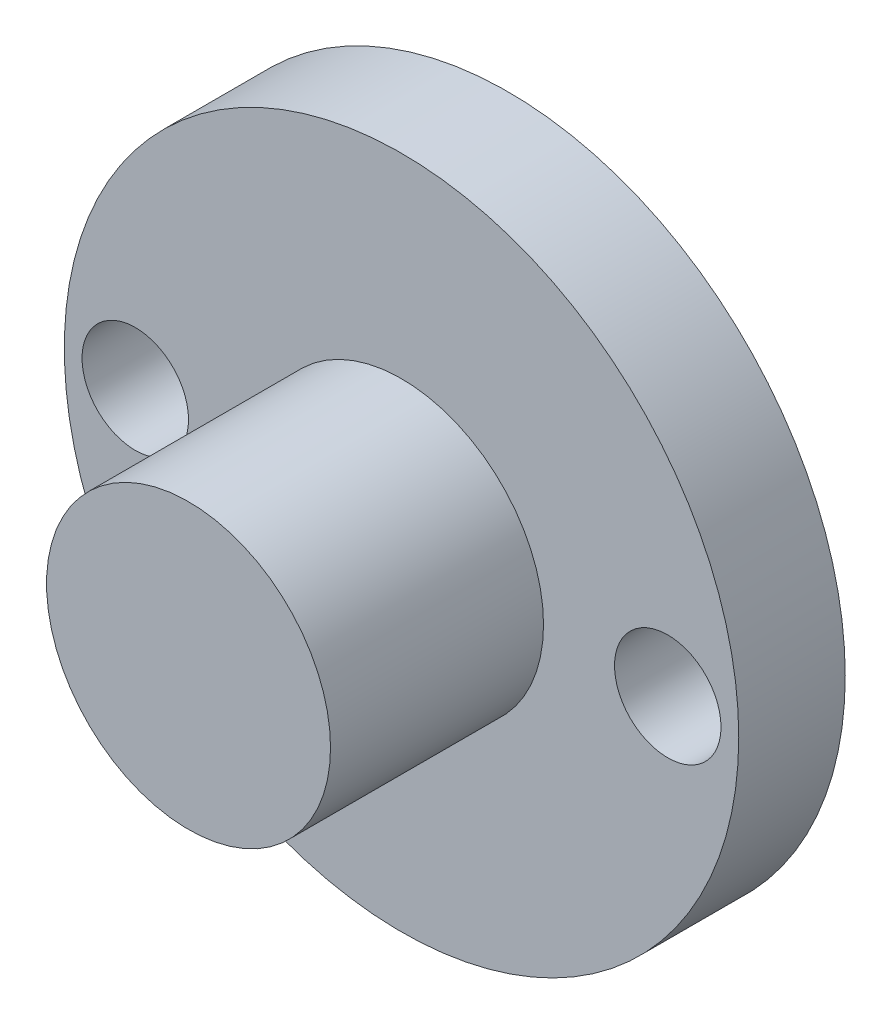
ISO-10303-21;
HEADER;
FILE_DESCRIPTION(('STEP AP214'),'2;1');
FILE_NAME('part.step','',(''),(''),'','','');
FILE_SCHEMA(('AUTOMOTIVE_DESIGN { 1 0 10303 214 1 1 1 1 }'));
ENDSEC;
DATA;
#1=APPLICATION_CONTEXT('core data for automotive mechanical design processes');
#2=APPLICATION_PROTOCOL_DEFINITION('international standard','automotive_design',2000,#1);
#3=PRODUCT_CONTEXT('',#1,'mechanical');
#4=PRODUCT('Part','Part','',(#3));
#5=PRODUCT_RELATED_PRODUCT_CATEGORY('part','',(#4));
#6=PRODUCT_DEFINITION_FORMATION('','',#4);
#7=PRODUCT_DEFINITION_CONTEXT('part definition',#1,'design');
#8=PRODUCT_DEFINITION('design','',#6,#7);
#9=PRODUCT_DEFINITION_SHAPE('','',#8);
#10=(LENGTH_UNIT() NAMED_UNIT(*) SI_UNIT(.MILLI.,.METRE.));
#11=(NAMED_UNIT(*) PLANE_ANGLE_UNIT() SI_UNIT($,.RADIAN.));
#12=(NAMED_UNIT(*) SI_UNIT($,.STERADIAN.) SOLID_ANGLE_UNIT());
#13=UNCERTAINTY_MEASURE_WITH_UNIT(LENGTH_MEASURE(1.E-05),#10,'distance_accuracy_value','');
#14=(GEOMETRIC_REPRESENTATION_CONTEXT(3) GLOBAL_UNCERTAINTY_ASSIGNED_CONTEXT((#13)) GLOBAL_UNIT_ASSIGNED_CONTEXT((#10,
#11,#12)) REPRESENTATION_CONTEXT('',''));
#15=CARTESIAN_POINT('',(0.,0.,0.));
#16=DIRECTION('',(0.,0.,1.));
#17=DIRECTION('',(1.,0.,0.));
#18=AXIS2_PLACEMENT_3D('',#15,#16,#17);
#19=CARTESIAN_POINT('',(0.,0.,3.));
#20=DIRECTION('',(0.,0.,-1.));
#21=DIRECTION('',(-1.,0.,0.));
#22=AXIS2_PLACEMENT_3D('',#19,#20,#21);
#23=CYLINDRICAL_SURFACE('',#22,9.5);
#24=CARTESIAN_POINT('',(0.,0.,3.));
#25=DIRECTION('',(0.,0.,1.));
#26=DIRECTION('',(1.,0.,0.));
#27=AXIS2_PLACEMENT_3D('',#24,#25,#26);
#28=CIRCLE('',#27,9.5);
#29=CARTESIAN_POINT('',(9.5,0.,3.));
#30=VERTEX_POINT('',#29);
#31=EDGE_CURVE('E42',#30,#30,#28,.T.);
#32=ORIENTED_EDGE('',*,*,#31,.F.);
#33=EDGE_LOOP('',(#32));
#34=FACE_BOUND('',#33,.T.);
#35=CARTESIAN_POINT('',(0.,0.,0.));
#36=DIRECTION('',(0.,0.,1.));
#37=DIRECTION('',(1.,0.,0.));
#38=AXIS2_PLACEMENT_3D('',#35,#36,#37);
#39=CIRCLE('',#38,9.5);
#40=CARTESIAN_POINT('',(9.5,0.,0.));
#41=VERTEX_POINT('',#40);
#42=EDGE_CURVE('E50',#41,#41,#39,.T.);
#43=ORIENTED_EDGE('',*,*,#42,.T.);
#44=EDGE_LOOP('',(#43));
#45=FACE_BOUND('',#44,.T.);
#46=ADVANCED_FACE('F30',(#34,#45),#23,.T.);
#47=CARTESIAN_POINT('',(0.,0.,3.));
#48=DIRECTION('',(0.,0.,1.));
#49=DIRECTION('',(1.,0.,0.));
#50=AXIS2_PLACEMENT_3D('',#47,#48,#49);
#51=PLANE('',#50);
#52=CARTESIAN_POINT('',(-7.5,0.,3.));
#53=DIRECTION('',(0.,0.,1.));
#54=DIRECTION('',(1.,0.,0.));
#55=AXIS2_PLACEMENT_3D('',#52,#53,#54);
#56=CIRCLE('',#55,1.5);
#57=CARTESIAN_POINT('',(-6.,0.,3.));
#58=VERTEX_POINT('',#57);
#59=EDGE_CURVE('E57',#58,#58,#56,.T.);
#60=ORIENTED_EDGE('',*,*,#59,.F.);
#61=EDGE_LOOP('',(#60));
#62=FACE_BOUND('',#61,.T.);
#63=CARTESIAN_POINT('',(7.5,0.,3.));
#64=DIRECTION('',(0.,0.,1.));
#65=DIRECTION('',(1.,0.,0.));
#66=AXIS2_PLACEMENT_3D('',#63,#64,#65);
#67=CIRCLE('',#66,1.5);
#68=CARTESIAN_POINT('',(9.,0.,3.));
#69=VERTEX_POINT('',#68);
#70=EDGE_CURVE('E62',#69,#69,#67,.T.);
#71=ORIENTED_EDGE('',*,*,#70,.F.);
#72=EDGE_LOOP('',(#71));
#73=FACE_BOUND('',#72,.T.);
#74=CARTESIAN_POINT('',(0.,0.,3.));
#75=DIRECTION('',(0.,0.,1.));
#76=DIRECTION('',(1.,0.,0.));
#77=AXIS2_PLACEMENT_3D('',#74,#75,#76);
#78=CIRCLE('',#77,4.);
#79=CARTESIAN_POINT('',(4.,0.,3.));
#80=VERTEX_POINT('',#79);
#81=EDGE_CURVE('E37',#80,#80,#78,.T.);
#82=ORIENTED_EDGE('',*,*,#81,.F.);
#83=EDGE_LOOP('',(#82));
#84=FACE_BOUND('',#83,.T.);
#85=ORIENTED_EDGE('',*,*,#31,.T.);
#86=EDGE_LOOP('',(#85));
#87=FACE_BOUND('',#86,.T.);
#88=ADVANCED_FACE('F72',(#62,#73,#84,#87),#51,.T.);
#89=CARTESIAN_POINT('',(0.,0.,0.));
#90=DIRECTION('',(0.,0.,1.));
#91=DIRECTION('',(1.,0.,0.));
#92=AXIS2_PLACEMENT_3D('',#89,#90,#91);
#93=PLANE('',#92);
#94=CARTESIAN_POINT('',(-7.5,0.,0.));
#95=DIRECTION('',(0.,0.,1.));
#96=DIRECTION('',(1.,0.,0.));
#97=AXIS2_PLACEMENT_3D('',#94,#95,#96);
#98=CIRCLE('',#97,1.5);
#99=CARTESIAN_POINT('',(-6.,0.,0.));
#100=VERTEX_POINT('',#99);
#101=EDGE_CURVE('E33',#100,#100,#98,.T.);
#102=ORIENTED_EDGE('',*,*,#101,.T.);
#103=EDGE_LOOP('',(#102));
#104=FACE_BOUND('',#103,.T.);
#105=CARTESIAN_POINT('',(7.5,0.,0.));
#106=DIRECTION('',(0.,0.,1.));
#107=DIRECTION('',(1.,0.,0.));
#108=AXIS2_PLACEMENT_3D('',#105,#106,#107);
#109=CIRCLE('',#108,1.5);
#110=CARTESIAN_POINT('',(9.,0.,0.));
#111=VERTEX_POINT('',#110);
#112=EDGE_CURVE('E55',#111,#111,#109,.T.);
#113=ORIENTED_EDGE('',*,*,#112,.T.);
#114=EDGE_LOOP('',(#113));
#115=FACE_BOUND('',#114,.T.);
#116=CARTESIAN_POINT('',(0.,0.,0.));
#117=DIRECTION('',(0.,0.,-1.));
#118=DIRECTION('',(-1.,0.,0.));
#119=AXIS2_PLACEMENT_3D('',#116,#117,#118);
#120=CIRCLE('',#119,2.5);
#121=CARTESIAN_POINT('',(-2.5,0.,0.));
#122=VERTEX_POINT('',#121);
#123=EDGE_CURVE('E10',#122,#122,#120,.T.);
#124=ORIENTED_EDGE('',*,*,#123,.F.);
#125=EDGE_LOOP('',(#124));
#126=FACE_BOUND('',#125,.T.);
#127=ORIENTED_EDGE('',*,*,#42,.F.);
#128=EDGE_LOOP('',(#127));
#129=FACE_BOUND('',#128,.T.);
#130=ADVANCED_FACE('F75',(#104,#115,#126,#129),#93,.F.);
#131=CARTESIAN_POINT('',(0.,0.,9.));
#132=DIRECTION('',(0.,0.,-1.));
#133=DIRECTION('',(-1.,0.,0.));
#134=AXIS2_PLACEMENT_3D('',#131,#132,#133);
#135=CYLINDRICAL_SURFACE('',#134,4.);
#136=CARTESIAN_POINT('',(0.,0.,9.));
#137=DIRECTION('',(0.,0.,1.));
#138=DIRECTION('',(1.,0.,0.));
#139=AXIS2_PLACEMENT_3D('',#136,#137,#138);
#140=CIRCLE('',#139,4.);
#141=CARTESIAN_POINT('',(4.,0.,9.));
#142=VERTEX_POINT('',#141);
#143=EDGE_CURVE('E48',#142,#142,#140,.T.);
#144=ORIENTED_EDGE('',*,*,#143,.F.);
#145=EDGE_LOOP('',(#144));
#146=FACE_BOUND('',#145,.T.);
#147=ORIENTED_EDGE('',*,*,#81,.T.);
#148=EDGE_LOOP('',(#147));
#149=FACE_BOUND('',#148,.T.);
#150=ADVANCED_FACE('F87',(#146,#149),#135,.T.);
#151=CARTESIAN_POINT('',(0.,0.,9.));
#152=DIRECTION('',(0.,0.,1.));
#153=DIRECTION('',(1.,0.,0.));
#154=AXIS2_PLACEMENT_3D('',#151,#152,#153);
#155=PLANE('',#154);
#156=ORIENTED_EDGE('',*,*,#143,.T.);
#157=EDGE_LOOP('',(#156));
#158=FACE_BOUND('',#157,.T.);
#159=ADVANCED_FACE('F92',(#158),#155,.T.);
#160=CARTESIAN_POINT('',(0.,0.,-1.5));
#161=DIRECTION('',(0.,0.,1.));
#162=DIRECTION('',(1.,0.,0.));
#163=AXIS2_PLACEMENT_3D('',#160,#161,#162);
#164=CYLINDRICAL_SURFACE('',#163,2.5);
#165=CARTESIAN_POINT('',(0.,0.,-1.5));
#166=DIRECTION('',(0.,0.,-1.));
#167=DIRECTION('',(-1.,0.,0.));
#168=AXIS2_PLACEMENT_3D('',#165,#166,#167);
#169=CIRCLE('',#168,2.5);
#170=CARTESIAN_POINT('',(-2.5,0.,-1.5));
#171=VERTEX_POINT('',#170);
#172=EDGE_CURVE('E46',#171,#171,#169,.T.);
#173=ORIENTED_EDGE('',*,*,#172,.F.);
#174=EDGE_LOOP('',(#173));
#175=FACE_BOUND('',#174,.T.);
#176=ORIENTED_EDGE('',*,*,#123,.T.);
#177=EDGE_LOOP('',(#176));
#178=FACE_BOUND('',#177,.T.);
#179=ADVANCED_FACE('F98',(#175,#178),#164,.T.);
#180=CARTESIAN_POINT('',(0.,0.,-1.5));
#181=DIRECTION('',(0.,0.,-1.));
#182=DIRECTION('',(-1.,0.,0.));
#183=AXIS2_PLACEMENT_3D('',#180,#181,#182);
#184=PLANE('',#183);
#185=ORIENTED_EDGE('',*,*,#172,.T.);
#186=EDGE_LOOP('',(#185));
#187=FACE_BOUND('',#186,.T.);
#188=ADVANCED_FACE('F102',(#187),#184,.T.);
#189=CARTESIAN_POINT('',(7.5,0.,-1.5));
#190=DIRECTION('',(0.,0.,1.));
#191=DIRECTION('',(1.,0.,0.));
#192=AXIS2_PLACEMENT_3D('',#189,#190,#191);
#193=CYLINDRICAL_SURFACE('',#192,1.5);
#194=ORIENTED_EDGE('',*,*,#70,.T.);
#195=EDGE_LOOP('',(#194));
#196=FACE_BOUND('',#195,.T.);
#197=ORIENTED_EDGE('',*,*,#112,.F.);
#198=EDGE_LOOP('',(#197));
#199=FACE_BOUND('',#198,.T.);
#200=ADVANCED_FACE('F69',(#196,#199),#193,.F.);
#201=CARTESIAN_POINT('',(-7.5,0.,-1.5));
#202=DIRECTION('',(0.,0.,1.));
#203=DIRECTION('',(1.,0.,0.));
#204=AXIS2_PLACEMENT_3D('',#201,#202,#203);
#205=CYLINDRICAL_SURFACE('',#204,1.5);
#206=ORIENTED_EDGE('',*,*,#59,.T.);
#207=EDGE_LOOP('',(#206));
#208=FACE_BOUND('',#207,.T.);
#209=ORIENTED_EDGE('',*,*,#101,.F.);
#210=EDGE_LOOP('',(#209));
#211=FACE_BOUND('',#210,.T.);
#212=ADVANCED_FACE('F109',(#208,#211),#205,.F.);
#213=CLOSED_SHELL('',(#46,#88,#130,#150,#159,#179,#188,#200,#212));
#214=MANIFOLD_SOLID_BREP('B2',#213);
#215=ADVANCED_BREP_SHAPE_REPRESENTATION('',(#18,#214),#14);
#216=SHAPE_DEFINITION_REPRESENTATION(#9,#215);
ENDSEC;
END-ISO-10303-21;
